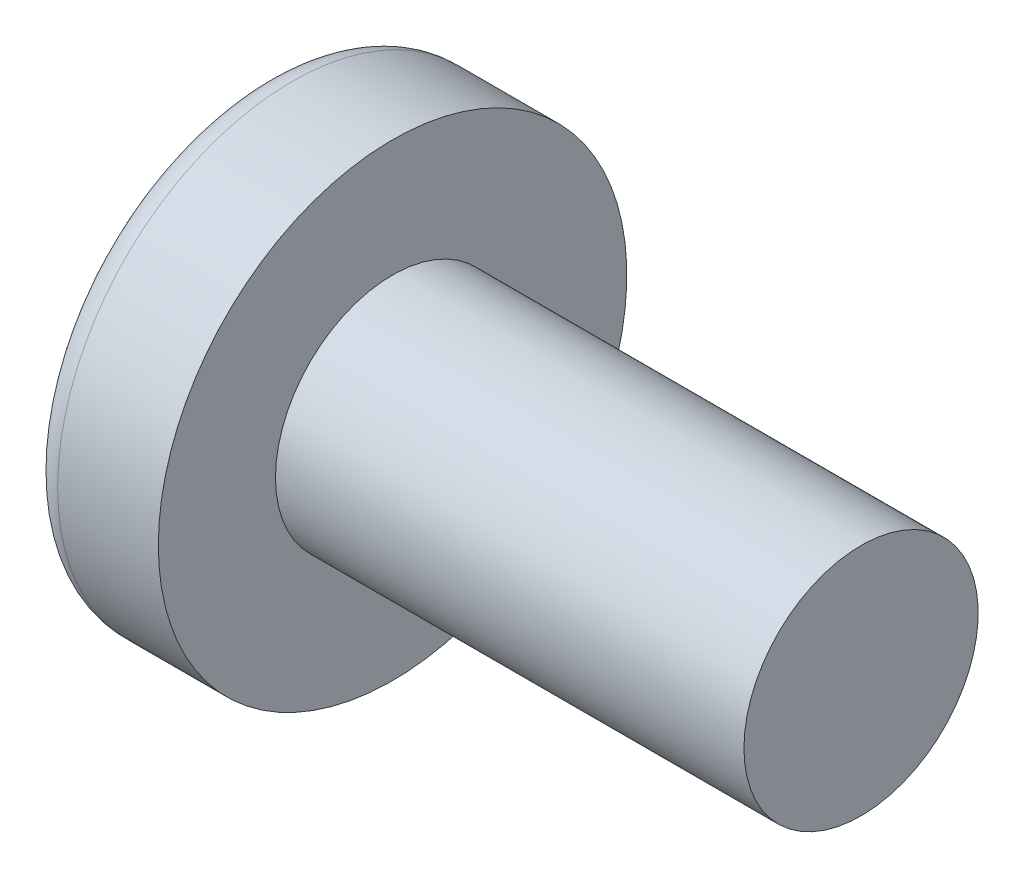
ISO-10303-21;
HEADER;
FILE_DESCRIPTION(('STEP AP214'),'2;1');
FILE_NAME('part.step','',(''),(''),'','','');
FILE_SCHEMA(('AUTOMOTIVE_DESIGN { 1 0 10303 214 1 1 1 1 }'));
ENDSEC;
DATA;
#1=APPLICATION_CONTEXT('core data for automotive mechanical design processes');
#2=APPLICATION_PROTOCOL_DEFINITION('international standard','automotive_design',2000,#1);
#3=PRODUCT_CONTEXT('',#1,'mechanical');
#4=PRODUCT('Part','Part','',(#3));
#5=PRODUCT_RELATED_PRODUCT_CATEGORY('part','',(#4));
#6=PRODUCT_DEFINITION_FORMATION('','',#4);
#7=PRODUCT_DEFINITION_CONTEXT('part definition',#1,'design');
#8=PRODUCT_DEFINITION('design','',#6,#7);
#9=PRODUCT_DEFINITION_SHAPE('','',#8);
#10=(LENGTH_UNIT() NAMED_UNIT(*) SI_UNIT(.MILLI.,.METRE.));
#11=(NAMED_UNIT(*) PLANE_ANGLE_UNIT() SI_UNIT($,.RADIAN.));
#12=(NAMED_UNIT(*) SI_UNIT($,.STERADIAN.) SOLID_ANGLE_UNIT());
#13=UNCERTAINTY_MEASURE_WITH_UNIT(LENGTH_MEASURE(1.E-05),#10,'distance_accuracy_value','');
#14=(GEOMETRIC_REPRESENTATION_CONTEXT(3) GLOBAL_UNCERTAINTY_ASSIGNED_CONTEXT((#13)) GLOBAL_UNIT_ASSIGNED_CONTEXT((#10,
#11,#12)) REPRESENTATION_CONTEXT('',''));
#15=CARTESIAN_POINT('',(0.,0.,0.));
#16=DIRECTION('',(0.,0.,1.));
#17=DIRECTION('',(1.,0.,0.));
#18=AXIS2_PLACEMENT_3D('',#15,#16,#17);
#19=CARTESIAN_POINT('',(1.53,0.175,-0.175));
#20=DIRECTION('',(-1.,0.,0.));
#21=DIRECTION('',(0.,0.,1.));
#22=AXIS2_PLACEMENT_3D('',#19,#20,#21);
#23=PLANE('',#22);
#24=DIRECTION('',(0.,1.,0.));
#25=VECTOR('',#24,1.);
#26=CARTESIAN_POINT('',(1.53,-0.175,0.175));
#27=LINE('',#26,#25);
#28=CARTESIAN_POINT('',(1.53000000000001,-0.175000000000024,0.17500000000007));
#29=VERTEX_POINT('',#28);
#30=CARTESIAN_POINT('',(1.53000000000001,0.175000000000047,0.175000000000024));
#31=VERTEX_POINT('',#30);
#32=EDGE_CURVE('E96',#29,#31,#27,.T.);
#33=ORIENTED_EDGE('',*,*,#32,.T.);
#34=DIRECTION('',(0.,0.,1.));
#35=VECTOR('',#34,1.);
#36=CARTESIAN_POINT('',(1.53,0.175,0.175));
#37=LINE('',#36,#35);
#38=CARTESIAN_POINT('',(1.53000000000001,0.175000000000023,-0.175000000000047));
#39=VERTEX_POINT('',#38);
#40=EDGE_CURVE('E179',#31,#39,#37,.F.);
#41=ORIENTED_EDGE('',*,*,#40,.T.);
#42=DIRECTION('',(0.,1.,0.));
#43=VECTOR('',#42,1.);
#44=CARTESIAN_POINT('',(1.53,0.175,-0.175));
#45=LINE('',#44,#43);
#46=CARTESIAN_POINT('',(1.53000000000001,-0.175000000000047,-0.175000000000024));
#47=VERTEX_POINT('',#46);
#48=EDGE_CURVE('E99',#39,#47,#45,.F.);
#49=ORIENTED_EDGE('',*,*,#48,.T.);
#50=DIRECTION('',(0.,0.,1.));
#51=VECTOR('',#50,1.);
#52=CARTESIAN_POINT('',(1.53,-0.175,-0.175));
#53=LINE('',#52,#51);
#54=EDGE_CURVE('E94',#47,#29,#53,.T.);
#55=ORIENTED_EDGE('',*,*,#54,.T.);
#56=EDGE_LOOP('',(#33,#41,#49,#55));
#57=FACE_BOUND('',#56,.T.);
#58=ADVANCED_FACE('F17',(#57),#23,.T.);
#59=CARTESIAN_POINT('',(1.53,0.175,-0.175));
#60=DIRECTION('',(0.605808178465619,0.,-0.795610740817499));
#61=DIRECTION('',(-0.795610740817499,0.,-0.605808178465619));
#62=AXIS2_PLACEMENT_3D('',#59,#60,#61);
#63=PLANE('',#62);
#64=ORIENTED_EDGE('',*,*,#48,.F.);
#65=DIRECTION('',(0.792336746135029,-0.0906267520091843,0.603315234802188));
#66=VECTOR('',#65,1.);
#67=CARTESIAN_POINT('',(0.195539940030044,0.327634320585383,-1.191108477036));
#68=LINE('',#67,#66);
#69=CARTESIAN_POINT('',(0.195539940029982,0.327634320585273,-1.19110847703603));
#70=VERTEX_POINT('',#69);
#71=EDGE_CURVE('E158',#70,#39,#68,.T.);
#72=ORIENTED_EDGE('',*,*,#71,.F.);
#73=CARTESIAN_POINT('',(0.19553994002992,-0.327634320585159,-1.19110847703605));
#74=CARTESIAN_POINT('',(0.18795976832639,-0.218422880390105,-1.19688030712404));
#75=CARTESIAN_POINT('',(0.184169682474625,-0.109211440195052,-1.19976622216803));
#76=CARTESIAN_POINT('',(0.184169682474625,0.109211440195056,-1.19976622216803));
#77=CARTESIAN_POINT('',(0.18795976832639,0.218422880390109,-1.19688030712404));
#78=CARTESIAN_POINT('',(0.195539940029921,0.327634320585163,-1.19110847703605));
#79=B_SPLINE_CURVE_WITH_KNOTS('',3,(#73,#74,#75,#76,#77,#78),.UNSPECIFIED.,.F.,.F.,(4,2,4),(0.,
0.327945860368665,0.65589172073733),.UNSPECIFIED.);
#80=CARTESIAN_POINT('',(0.195539940029981,-0.327634320585267,-1.19110847703603));
#81=VERTEX_POINT('',#80);
#82=EDGE_CURVE('E20',#81,#70,#79,.T.);
#83=ORIENTED_EDGE('',*,*,#82,.F.);
#84=DIRECTION('',(-0.79233674613503,-0.0906267520091801,-0.603315234802189));
#85=VECTOR('',#84,1.);
#86=CARTESIAN_POINT('',(1.53000000000001,-0.175000000000116,-0.175));
#87=LINE('',#86,#85);
#88=EDGE_CURVE('E163',#47,#81,#87,.T.);
#89=ORIENTED_EDGE('',*,*,#88,.F.);
#90=EDGE_LOOP('',(#64,#72,#83,#89));
#91=FACE_BOUND('',#90,.T.);
#92=ADVANCED_FACE('F301',(#91),#63,.F.);
#93=CARTESIAN_POINT('',(1.53,0.175,0.175));
#94=DIRECTION('',(0.605808178465619,0.795610740817499,0.));
#95=DIRECTION('',(-0.795610740817499,0.605808178465619,0.));
#96=AXIS2_PLACEMENT_3D('',#93,#94,#95);
#97=PLANE('',#96);
#98=ORIENTED_EDGE('',*,*,#40,.F.);
#99=DIRECTION('',(0.79233674613503,-0.603315234802189,-0.0906267520091823));
#100=VECTOR('',#99,1.);
#101=CARTESIAN_POINT('',(0.195539940030044,1.191108477036,0.327634320585379));
#102=LINE('',#101,#100);
#103=CARTESIAN_POINT('',(0.195539940029982,1.19110847703603,0.32763432058527));
#104=VERTEX_POINT('',#103);
#105=EDGE_CURVE('E143',#104,#31,#102,.T.);
#106=ORIENTED_EDGE('',*,*,#105,.F.);
#107=CARTESIAN_POINT('',(0.19553994002992,1.19110847703605,-0.327634320585162));
#108=CARTESIAN_POINT('',(0.187959768326372,1.19688030712378,-0.21842288039011));
#109=CARTESIAN_POINT('',(0.184169682474647,1.19976622216774,-0.109211440195056));
#110=CARTESIAN_POINT('',(0.184169682474842,1.19976622216812,0.109211440195063));
#111=CARTESIAN_POINT('',(0.187959768326763,1.19688030712455,0.218422880390129));
#112=CARTESIAN_POINT('',(0.195539940030506,1.1911084770372,0.327634320585196));
#113=B_SPLINE_CURVE_WITH_KNOTS('',3,(#107,#108,#109,#110,#111,#112),.UNSPECIFIED.,.F.,.F.,(4,2,
4),(0.,0.327945860368659,0.655891720737343),.UNSPECIFIED.);
#114=CARTESIAN_POINT('',(0.195539940029982,1.19110847703603,-0.32763432058527));
#115=VERTEX_POINT('',#114);
#116=EDGE_CURVE('E181',#115,#104,#113,.T.);
#117=ORIENTED_EDGE('',*,*,#116,.F.);
#118=DIRECTION('',(-0.79233674613503,0.603315234802189,-0.0906267520091823));
#119=VECTOR('',#118,1.);
#120=CARTESIAN_POINT('',(1.53000000000001,0.175,-0.175000000000117));
#121=LINE('',#120,#119);
#122=EDGE_CURVE('E148',#39,#115,#121,.T.);
#123=ORIENTED_EDGE('',*,*,#122,.F.);
#124=EDGE_LOOP('',(#98,#106,#117,#123));
#125=FACE_BOUND('',#124,.T.);
#126=ADVANCED_FACE('F298',(#125),#97,.F.);
#127=CARTESIAN_POINT('',(1.53,-0.175,0.175));
#128=DIRECTION('',(0.605808178465619,0.,0.795610740817499));
#129=DIRECTION('',(0.795610740817499,0.,-0.605808178465619));
#130=AXIS2_PLACEMENT_3D('',#127,#128,#129);
#131=PLANE('',#130);
#132=ORIENTED_EDGE('',*,*,#32,.F.);
#133=DIRECTION('',(0.792336746135029,0.0906267520091844,-0.603315234802188));
#134=VECTOR('',#133,1.);
#135=CARTESIAN_POINT('',(0.195539940030044,-0.327634320585383,1.191108477036));
#136=LINE('',#135,#134);
#137=CARTESIAN_POINT('',(0.195539940029982,-0.327634320585273,1.19110847703603));
#138=VERTEX_POINT('',#137);
#139=EDGE_CURVE('E107',#138,#29,#136,.T.);
#140=ORIENTED_EDGE('',*,*,#139,.F.);
#141=CARTESIAN_POINT('',(0.19553994002992,0.327634320585159,1.19110847703605));
#142=CARTESIAN_POINT('',(0.18795976832639,0.218422880390106,1.19688030712404));
#143=CARTESIAN_POINT('',(0.184169682474625,0.109211440195052,1.19976622216803));
#144=CARTESIAN_POINT('',(0.184169682474625,-0.109211440195055,1.19976622216803));
#145=CARTESIAN_POINT('',(0.18795976832639,-0.218422880390109,1.19688030712403));
#146=CARTESIAN_POINT('',(0.19553994002992,-0.327634320585162,1.19110847703605));
#147=B_SPLINE_CURVE_WITH_KNOTS('',3,(#141,#142,#143,#144,#145,#146),.UNSPECIFIED.,.F.,.F.,(4,2,
4),(0.,0.327945860368665,0.65589172073733),.UNSPECIFIED.);
#148=CARTESIAN_POINT('',(0.195539940029982,0.327634320585267,1.19110847703603));
#149=VERTEX_POINT('',#148);
#150=EDGE_CURVE('E112',#149,#138,#147,.T.);
#151=ORIENTED_EDGE('',*,*,#150,.F.);
#152=DIRECTION('',(-0.79233674613503,0.0906267520091802,0.603315234802189));
#153=VECTOR('',#152,1.);
#154=CARTESIAN_POINT('',(1.53000000000001,0.175000000000117,0.175));
#155=LINE('',#154,#153);
#156=EDGE_CURVE('E110',#31,#149,#155,.T.);
#157=ORIENTED_EDGE('',*,*,#156,.F.);
#158=EDGE_LOOP('',(#132,#140,#151,#157));
#159=FACE_BOUND('',#158,.T.);
#160=ADVANCED_FACE('F106',(#159),#131,.F.);
#161=CARTESIAN_POINT('',(1.53,-0.175,-0.175));
#162=DIRECTION('',(0.605808178465619,-0.795610740817499,0.));
#163=DIRECTION('',(0.795610740817499,0.605808178465619,0.));
#164=AXIS2_PLACEMENT_3D('',#161,#162,#163);
#165=PLANE('',#164);
#166=ORIENTED_EDGE('',*,*,#54,.F.);
#167=DIRECTION('',(0.79233674613503,0.603315234802189,0.0906267520091823));
#168=VECTOR('',#167,1.);
#169=CARTESIAN_POINT('',(0.195539940030044,-1.191108477036,-0.327634320585378));
#170=LINE('',#169,#168);
#171=CARTESIAN_POINT('',(0.195539940029982,-1.19110847703603,-0.32763432058527));
#172=VERTEX_POINT('',#171);
#173=EDGE_CURVE('E100',#172,#47,#170,.T.);
#174=ORIENTED_EDGE('',*,*,#173,.F.);
#175=CARTESIAN_POINT('',(0.19553994002992,-1.19110847703605,0.327634320585161));
#176=CARTESIAN_POINT('',(0.187959768326372,-1.19688030712378,0.218422880390109));
#177=CARTESIAN_POINT('',(0.184169682474647,-1.19976622216774,0.109211440195055));
#178=CARTESIAN_POINT('',(0.184169682474842,-1.19976622216812,-0.109211440195064));
#179=CARTESIAN_POINT('',(0.187959768326763,-1.19688030712455,-0.21842288039013));
#180=CARTESIAN_POINT('',(0.195539940030506,-1.1911084770372,-0.327634320585197));
#181=B_SPLINE_CURVE_WITH_KNOTS('',3,(#175,#176,#177,#178,#179,#180),.UNSPECIFIED.,.F.,.F.,(4,2,
4),(0.,0.327945860368659,0.655891720737343),.UNSPECIFIED.);
#182=CARTESIAN_POINT('',(0.195539940029982,-1.19110847703603,0.327634320585269));
#183=VERTEX_POINT('',#182);
#184=EDGE_CURVE('E40',#183,#172,#181,.T.);
#185=ORIENTED_EDGE('',*,*,#184,.F.);
#186=DIRECTION('',(-0.79233674613503,-0.603315234802189,0.0906267520091822));
#187=VECTOR('',#186,1.);
#188=CARTESIAN_POINT('',(1.53000000000001,-0.175,0.175000000000117));
#189=LINE('',#188,#187);
#190=EDGE_CURVE('E122',#29,#183,#189,.T.);
#191=ORIENTED_EDGE('',*,*,#190,.F.);
#192=EDGE_LOOP('',(#166,#174,#185,#191));
#193=FACE_BOUND('',#192,.T.);
#194=ADVANCED_FACE('F123',(#193),#165,.F.);
#195=CARTESIAN_POINT('',(1.75982832618,0.,-0.148712446352));
#196=DIRECTION('',(-0.113638160509999,0.,0.993522203312993));
#197=DIRECTION('',(0.993522203312993,0.,0.113638160509999));
#198=AXIS2_PLACEMENT_3D('',#195,#196,#197);
#199=PLANE('',#198);
#200=DIRECTION('',(0.987168682960103,0.112911450665712,0.112911450665468));
#201=VECTOR('',#200,1.);
#202=CARTESIAN_POINT('',(0.0301382525496957,-0.346552814251487,-0.346552814251));
#203=LINE('',#202,#201);
#204=CARTESIAN_POINT('',(0.0301382525497051,-0.346552814251486,-0.346552814251049));
#205=VERTEX_POINT('',#204);
#206=EDGE_CURVE('E74',#205,#47,#203,.T.);
#207=ORIENTED_EDGE('',*,*,#206,.F.);
#208=CARTESIAN_POINT('',(0.195539940029933,-1.19110847703603,-0.327634320585392));
#209=CARTESIAN_POINT('',(0.152876044928763,-1.0533445365469,-0.332514177868217));
#210=CARTESIAN_POINT('',(0.117760623421494,-0.914082927736931,-0.336530647648472));
#211=CARTESIAN_POINT('',(0.0626267275947612,-0.632564373475339,-0.342836812203841));
#212=CARTESIAN_POINT('',(0.0426082532752965,-0.490307428023714,-0.345126506978955));
#213=CARTESIAN_POINT('',(0.0301382525497336,-0.34655281425126,-0.346552814251499));
#214=B_SPLINE_CURVE_WITH_KNOTS('',3,(#208,#209,#210,#211,#212,#213),.UNSPECIFIED.,.F.,.F.,(4,2,
4),(0.,0.431030375854441,0.862060751708881),.UNSPECIFIED.);
#215=EDGE_CURVE('E126',#172,#205,#214,.T.);
#216=ORIENTED_EDGE('',*,*,#215,.F.);
#217=ORIENTED_EDGE('',*,*,#173,.T.);
#218=EDGE_LOOP('',(#207,#216,#217));
#219=FACE_BOUND('',#218,.T.);
#220=ADVANCED_FACE('F266',(#219),#199,.T.);
#221=CARTESIAN_POINT('',(1.75982832618,-0.148712446352,0.));
#222=DIRECTION('',(-0.113638160509999,0.993522203312993,0.));
#223=DIRECTION('',(-0.993522203312993,-0.113638160509999,0.));
#224=AXIS2_PLACEMENT_3D('',#221,#222,#223);
#225=PLANE('',#224);
#226=ORIENTED_EDGE('',*,*,#206,.T.);
#227=ORIENTED_EDGE('',*,*,#88,.T.);
#228=CARTESIAN_POINT('',(0.0301382525497145,-0.346552814251485,-0.346552814251098));
#229=CARTESIAN_POINT('',(0.0426082532752755,-0.345126506978949,-0.49030742802358));
#230=CARTESIAN_POINT('',(0.0626267275947409,-0.342836812203839,-0.632564373475233));
#231=CARTESIAN_POINT('',(0.11776062342148,-0.336530647648473,-0.914082927736879));
#232=CARTESIAN_POINT('',(0.152876044928754,-0.332514177868217,-1.05334453654687));
#233=CARTESIAN_POINT('',(0.195539940029933,-0.327634320585387,-1.19110847703603));
#234=B_SPLINE_CURVE_WITH_KNOTS('',3,(#228,#229,#230,#231,#232,#233),.UNSPECIFIED.,.F.,.F.,(4,2,
4),(0.,0.431030375854523,0.862060751709045),.UNSPECIFIED.);
#235=EDGE_CURVE('E270',#205,#81,#234,.T.);
#236=ORIENTED_EDGE('',*,*,#235,.F.);
#237=EDGE_LOOP('',(#226,#227,#236));
#238=FACE_BOUND('',#237,.T.);
#239=ADVANCED_FACE('F261',(#238),#225,.T.);
#240=CARTESIAN_POINT('',(1.75982832618,0.148712446352,0.));
#241=DIRECTION('',(-0.113638160509999,-0.993522203312993,0.));
#242=DIRECTION('',(0.993522203312993,-0.113638160509999,0.));
#243=AXIS2_PLACEMENT_3D('',#240,#241,#242);
#244=PLANE('',#243);
#245=ORIENTED_EDGE('',*,*,#71,.T.);
#246=DIRECTION('',(0.987168682960103,-0.112911450665468,0.112911450665712));
#247=VECTOR('',#246,1.);
#248=CARTESIAN_POINT('',(0.0301382525496959,0.346552814251,-0.346552814251488));
#249=LINE('',#248,#247);
#250=CARTESIAN_POINT('',(0.0301382525497061,0.346552814251049,-0.346552814251488));
#251=VERTEX_POINT('',#250);
#252=EDGE_CURVE('E153',#251,#39,#249,.T.);
#253=ORIENTED_EDGE('',*,*,#252,.F.);
#254=CARTESIAN_POINT('',(0.195539940029933,0.327634320585395,-1.19110847703603));
#255=CARTESIAN_POINT('',(0.15287604492876,0.332514177868223,-1.05334453654689));
#256=CARTESIAN_POINT('',(0.117760623421489,0.336530647648478,-0.91408292773691));
#257=CARTESIAN_POINT('',(0.0626267275947526,0.342836812203842,-0.632564373475297));
#258=CARTESIAN_POINT('',(0.0426082532752867,0.345126506978951,-0.490307428023661));
#259=CARTESIAN_POINT('',(0.0301382525497232,0.346552814251487,-0.346552814251195));
#260=B_SPLINE_CURVE_WITH_KNOTS('',3,(#254,#255,#256,#257,#258,#259),.UNSPECIFIED.,.F.,.F.,(4,2,
4),(0.,0.431030375854474,0.862060751708948),.UNSPECIFIED.);
#261=EDGE_CURVE('E246',#70,#251,#260,.T.);
#262=ORIENTED_EDGE('',*,*,#261,.F.);
#263=EDGE_LOOP('',(#245,#253,#262));
#264=FACE_BOUND('',#263,.T.);
#265=ADVANCED_FACE('F256',(#264),#244,.T.);
#266=CARTESIAN_POINT('',(1.75982832618,0.,-0.148712446352));
#267=DIRECTION('',(-0.113638160509999,0.,0.993522203312993));
#268=DIRECTION('',(0.993522203312993,0.,0.113638160509999));
#269=AXIS2_PLACEMENT_3D('',#266,#267,#268);
#270=PLANE('',#269);
#271=ORIENTED_EDGE('',*,*,#252,.T.);
#272=ORIENTED_EDGE('',*,*,#122,.T.);
#273=CARTESIAN_POINT('',(0.0301382525497163,0.346552814251097,-0.346552814251487));
#274=CARTESIAN_POINT('',(0.0426082532752764,0.49030742802358,-0.345126506978951));
#275=CARTESIAN_POINT('',(0.0626267275947411,0.632564373475233,-0.342836812203842));
#276=CARTESIAN_POINT('',(0.11776062342148,0.914082927736878,-0.336530647648476));
#277=CARTESIAN_POINT('',(0.152876044928754,1.05334453654687,-0.33251417786822));
#278=CARTESIAN_POINT('',(0.195539940029933,1.19110847703603,-0.32763432058539));
#279=B_SPLINE_CURVE_WITH_KNOTS('',3,(#273,#274,#275,#276,#277,#278),.UNSPECIFIED.,.F.,.F.,(4,2,
4),(0.,0.431030375854522,0.862060751709044),.UNSPECIFIED.);
#280=EDGE_CURVE('E239',#251,#115,#279,.T.);
#281=ORIENTED_EDGE('',*,*,#280,.F.);
#282=EDGE_LOOP('',(#271,#272,#281));
#283=FACE_BOUND('',#282,.T.);
#284=ADVANCED_FACE('F253',(#283),#270,.T.);
#285=CARTESIAN_POINT('',(1.75982832618,0.,0.148712446352));
#286=DIRECTION('',(-0.113638160509999,0.,-0.993522203312993));
#287=DIRECTION('',(-0.993522203312993,0.,0.113638160509999));
#288=AXIS2_PLACEMENT_3D('',#285,#286,#287);
#289=PLANE('',#288);
#290=DIRECTION('',(0.987168682960103,-0.112911450665712,-0.112911450665468));
#291=VECTOR('',#290,1.);
#292=CARTESIAN_POINT('',(0.0301382525496957,0.346552814251487,0.346552814251));
#293=LINE('',#292,#291);
#294=CARTESIAN_POINT('',(0.0301382525497051,0.346552814251486,0.346552814251048));
#295=VERTEX_POINT('',#294);
#296=EDGE_CURVE('E139',#295,#31,#293,.T.);
#297=ORIENTED_EDGE('',*,*,#296,.F.);
#298=CARTESIAN_POINT('',(0.195539940029933,1.19110847703603,0.327634320585391));
#299=CARTESIAN_POINT('',(0.152876044928762,1.0533445365469,0.332514177868217));
#300=CARTESIAN_POINT('',(0.117760623421493,0.914082927736931,0.336530647648472));
#301=CARTESIAN_POINT('',(0.0626267275947594,0.632564373475339,0.342836812203842));
#302=CARTESIAN_POINT('',(0.0426082532752946,0.490307428023714,0.345126506978956));
#303=CARTESIAN_POINT('',(0.0301382525497319,0.346552814251259,0.3465528142515));
#304=B_SPLINE_CURVE_WITH_KNOTS('',3,(#298,#299,#300,#301,#302,#303),.UNSPECIFIED.,.F.,.F.,(4,2,
4),(0.,0.431030375854441,0.862060751708882),.UNSPECIFIED.);
#305=EDGE_CURVE('E232',#104,#295,#304,.T.);
#306=ORIENTED_EDGE('',*,*,#305,.F.);
#307=ORIENTED_EDGE('',*,*,#105,.T.);
#308=EDGE_LOOP('',(#297,#306,#307));
#309=FACE_BOUND('',#308,.T.);
#310=ADVANCED_FACE('F221',(#309),#289,.T.);
#311=CARTESIAN_POINT('',(1.75982832618,0.148712446352,0.));
#312=DIRECTION('',(-0.113638160509999,-0.993522203312993,0.));
#313=DIRECTION('',(0.993522203312993,-0.113638160509999,0.));
#314=AXIS2_PLACEMENT_3D('',#311,#312,#313);
#315=PLANE('',#314);
#316=ORIENTED_EDGE('',*,*,#296,.T.);
#317=ORIENTED_EDGE('',*,*,#156,.T.);
#318=CARTESIAN_POINT('',(0.0301382525497145,0.346552814251485,0.346552814251097));
#319=CARTESIAN_POINT('',(0.0426082532752754,0.345126506978949,0.490307428023579));
#320=CARTESIAN_POINT('',(0.0626267275947407,0.342836812203839,0.632564373475232));
#321=CARTESIAN_POINT('',(0.11776062342148,0.336530647648473,0.914082927736878));
#322=CARTESIAN_POINT('',(0.152876044928754,0.332514177868217,1.05334453654687));
#323=CARTESIAN_POINT('',(0.195539940029933,0.327634320585387,1.19110847703603));
#324=B_SPLINE_CURVE_WITH_KNOTS('',3,(#318,#319,#320,#321,#322,#323),.UNSPECIFIED.,.F.,.F.,(4,2,
4),(0.,0.431030375854522,0.862060751709045),.UNSPECIFIED.);
#325=EDGE_CURVE('E225',#295,#149,#324,.T.);
#326=ORIENTED_EDGE('',*,*,#325,.F.);
#327=EDGE_LOOP('',(#316,#317,#326));
#328=FACE_BOUND('',#327,.T.);
#329=ADVANCED_FACE('F217',(#328),#315,.T.);
#330=CARTESIAN_POINT('',(1.75982832618,-0.148712446352,0.));
#331=DIRECTION('',(-0.113638160509999,0.993522203312993,0.));
#332=DIRECTION('',(-0.993522203312993,-0.113638160509999,0.));
#333=AXIS2_PLACEMENT_3D('',#330,#331,#332);
#334=PLANE('',#333);
#335=ORIENTED_EDGE('',*,*,#139,.T.);
#336=DIRECTION('',(0.987168682960103,0.112911450665468,-0.112911450665712));
#337=VECTOR('',#336,1.);
#338=CARTESIAN_POINT('',(0.0301382525496959,-0.346552814251,0.346552814251488));
#339=LINE('',#338,#337);
#340=CARTESIAN_POINT('',(0.030138252549706,-0.346552814251049,0.346552814251487));
#341=VERTEX_POINT('',#340);
#342=EDGE_CURVE('E117',#341,#29,#339,.T.);
#343=ORIENTED_EDGE('',*,*,#342,.F.);
#344=CARTESIAN_POINT('',(0.195539940029933,-0.327634320585395,1.19110847703603));
#345=CARTESIAN_POINT('',(0.152876044928759,-0.332514177868224,1.05334453654689));
#346=CARTESIAN_POINT('',(0.117760623421488,-0.336530647648479,0.914082927736909));
#347=CARTESIAN_POINT('',(0.0626267275947518,-0.342836812203842,0.632564373475296));
#348=CARTESIAN_POINT('',(0.0426082532752862,-0.345126506978951,0.49030742802366));
#349=CARTESIAN_POINT('',(0.0301382525497232,-0.346552814251486,0.346552814251194));
#350=B_SPLINE_CURVE_WITH_KNOTS('',3,(#344,#345,#346,#347,#348,#349),.UNSPECIFIED.,.F.,.F.,(4,2,
4),(0.,0.431030375854474,0.862060751708948),.UNSPECIFIED.);
#351=EDGE_CURVE('E120',#138,#341,#350,.T.);
#352=ORIENTED_EDGE('',*,*,#351,.F.);
#353=EDGE_LOOP('',(#335,#343,#352));
#354=FACE_BOUND('',#353,.T.);
#355=ADVANCED_FACE('F115',(#354),#334,.T.);
#356=CARTESIAN_POINT('',(1.75982832618,0.,0.148712446352));
#357=DIRECTION('',(-0.113638160509999,0.,-0.993522203312993));
#358=DIRECTION('',(-0.993522203312993,0.,0.113638160509999));
#359=AXIS2_PLACEMENT_3D('',#356,#357,#358);
#360=PLANE('',#359);
#361=ORIENTED_EDGE('',*,*,#342,.T.);
#362=ORIENTED_EDGE('',*,*,#190,.T.);
#363=CARTESIAN_POINT('',(0.0301382525497162,-0.346552814251097,0.346552814251485));
#364=CARTESIAN_POINT('',(0.0426082532752764,-0.49030742802358,0.34512650697895));
#365=CARTESIAN_POINT('',(0.0626267275947412,-0.632564373475232,0.342836812203841));
#366=CARTESIAN_POINT('',(0.11776062342148,-0.914082927736878,0.336530647648476));
#367=CARTESIAN_POINT('',(0.152876044928754,-1.05334453654687,0.33251417786822));
#368=CARTESIAN_POINT('',(0.195539940029933,-1.19110847703603,0.327634320585391));
#369=B_SPLINE_CURVE_WITH_KNOTS('',3,(#363,#364,#365,#366,#367,#368),.UNSPECIFIED.,.F.,.F.,(4,2,
4),(0.,0.431030375854522,0.862060751709045),.UNSPECIFIED.);
#370=EDGE_CURVE('E129',#341,#183,#369,.T.);
#371=ORIENTED_EDGE('',*,*,#370,.F.);
#372=EDGE_LOOP('',(#361,#362,#371));
#373=FACE_BOUND('',#372,.T.);
#374=ADVANCED_FACE('F128',(#373),#360,.T.);
#375=CARTESIAN_POINT('',(4.,0.,0.));
#376=DIRECTION('',(0.,1.,0.));
#377=DIRECTION('',(1.,0.,0.));
#378=AXIS2_PLACEMENT_3D('',#375,#376,#377);
#379=SPHERICAL_SURFACE('',#378,4.);
#380=CARTESIAN_POINT('',(0.78389734472545,0.,0.));
#381=DIRECTION('',(-1.,0.,0.));
#382=DIRECTION('',(0.,0.,1.));
#383=AXIS2_PLACEMENT_3D('',#380,#381,#382);
#384=CIRCLE('',#383,2.37837837837841);
#385=CARTESIAN_POINT('',(0.78389734472545,0.,2.37837837837841));
#386=VERTEX_POINT('',#385);
#387=EDGE_CURVE('E193',#386,#386,#384,.F.);
#388=ORIENTED_EDGE('',*,*,#387,.F.);
#389=EDGE_LOOP('',(#388));
#390=FACE_BOUND('',#389,.T.);
#391=ORIENTED_EDGE('',*,*,#370,.T.);
#392=ORIENTED_EDGE('',*,*,#184,.T.);
#393=ORIENTED_EDGE('',*,*,#215,.T.);
#394=ORIENTED_EDGE('',*,*,#235,.T.);
#395=ORIENTED_EDGE('',*,*,#82,.T.);
#396=ORIENTED_EDGE('',*,*,#261,.T.);
#397=ORIENTED_EDGE('',*,*,#280,.T.);
#398=ORIENTED_EDGE('',*,*,#116,.T.);
#399=ORIENTED_EDGE('',*,*,#305,.T.);
#400=ORIENTED_EDGE('',*,*,#325,.T.);
#401=ORIENTED_EDGE('',*,*,#150,.T.);
#402=ORIENTED_EDGE('',*,*,#351,.T.);
#403=EDGE_LOOP('',(#391,#392,#393,#394,#395,#396,#397,#398,#399,#400,#401,#402));
#404=FACE_BOUND('',#403,.T.);
#405=ADVANCED_FACE('F208',(#390,#404),#379,.T.);
#406=CARTESIAN_POINT('',(1.025105043871,0.,0.));
#407=DIRECTION('',(-1.,0.,0.));
#408=DIRECTION('',(0.,0.,1.));
#409=AXIS2_PLACEMENT_3D('',#406,#407,#408);
#410=TOROIDAL_SURFACE('',#409,2.2,0.3);
#411=ORIENTED_EDGE('',*,*,#387,.T.);
#412=EDGE_LOOP('',(#411));
#413=FACE_BOUND('',#412,.T.);
#414=CARTESIAN_POINT('',(1.025105043871,0.,0.));
#415=DIRECTION('',(-1.,0.,0.));
#416=DIRECTION('',(0.,0.,1.));
#417=AXIS2_PLACEMENT_3D('',#414,#415,#416);
#418=CIRCLE('',#417,2.5);
#419=CARTESIAN_POINT('',(1.025105043871,0.,2.5));
#420=VERTEX_POINT('',#419);
#421=EDGE_CURVE('E192',#420,#420,#418,.F.);
#422=ORIENTED_EDGE('',*,*,#421,.F.);
#423=EDGE_LOOP('',(#422));
#424=FACE_BOUND('',#423,.T.);
#425=ADVANCED_FACE('F338',(#413,#424),#410,.T.);
#426=CARTESIAN_POINT('',(-25.4,0.,0.));
#427=DIRECTION('',(-1.,0.,0.));
#428=DIRECTION('',(0.,0.,1.));
#429=AXIS2_PLACEMENT_3D('',#426,#427,#428);
#430=CYLINDRICAL_SURFACE('',#429,2.5);
#431=ORIENTED_EDGE('',*,*,#421,.T.);
#432=EDGE_LOOP('',(#431));
#433=FACE_BOUND('',#432,.T.);
#434=CARTESIAN_POINT('',(2.1,0.,0.));
#435=DIRECTION('',(-1.,0.,0.));
#436=DIRECTION('',(0.,0.,1.));
#437=AXIS2_PLACEMENT_3D('',#434,#435,#436);
#438=CIRCLE('',#437,2.5);
#439=CARTESIAN_POINT('',(2.1,0.,2.5));
#440=VERTEX_POINT('',#439);
#441=EDGE_CURVE('E189',#440,#440,#438,.T.);
#442=ORIENTED_EDGE('',*,*,#441,.T.);
#443=EDGE_LOOP('',(#442));
#444=FACE_BOUND('',#443,.T.);
#445=ADVANCED_FACE('F335',(#433,#444),#430,.T.);
#446=CARTESIAN_POINT('',(7.1,1.25,0.));
#447=DIRECTION('',(1.,0.,0.));
#448=DIRECTION('',(0.,0.,-1.));
#449=AXIS2_PLACEMENT_3D('',#446,#447,#448);
#450=PLANE('',#449);
#451=CARTESIAN_POINT('',(7.1,0.,0.));
#452=DIRECTION('',(-1.,0.,0.));
#453=DIRECTION('',(0.,0.,1.));
#454=AXIS2_PLACEMENT_3D('',#451,#452,#453);
#455=CIRCLE('',#454,1.25);
#456=CARTESIAN_POINT('',(7.1,0.,1.25));
#457=VERTEX_POINT('',#456);
#458=EDGE_CURVE('E31',#457,#457,#455,.T.);
#459=ORIENTED_EDGE('',*,*,#458,.F.);
#460=EDGE_LOOP('',(#459));
#461=FACE_BOUND('',#460,.T.);
#462=ADVANCED_FACE('F328',(#461),#450,.T.);
#463=CARTESIAN_POINT('',(2.1,1.25,0.));
#464=DIRECTION('',(-1.,0.,0.));
#465=DIRECTION('',(0.,0.,1.));
#466=AXIS2_PLACEMENT_3D('',#463,#464,#465);
#467=PLANE('',#466);
#468=CARTESIAN_POINT('',(2.1,0.,0.));
#469=DIRECTION('',(-1.,0.,0.));
#470=DIRECTION('',(0.,0.,1.));
#471=AXIS2_PLACEMENT_3D('',#468,#469,#470);
#472=CIRCLE('',#471,1.25);
#473=CARTESIAN_POINT('',(2.1,0.,1.25));
#474=VERTEX_POINT('',#473);
#475=EDGE_CURVE('E11',#474,#474,#472,.F.);
#476=ORIENTED_EDGE('',*,*,#475,.F.);
#477=EDGE_LOOP('',(#476));
#478=FACE_BOUND('',#477,.T.);
#479=ORIENTED_EDGE('',*,*,#441,.F.);
#480=EDGE_LOOP('',(#479));
#481=FACE_BOUND('',#480,.T.);
#482=ADVANCED_FACE('F322',(#478,#481),#467,.F.);
#483=CARTESIAN_POINT('',(-25.4,0.,0.));
#484=DIRECTION('',(-1.,0.,0.));
#485=DIRECTION('',(0.,0.,1.));
#486=AXIS2_PLACEMENT_3D('',#483,#484,#485);
#487=CYLINDRICAL_SURFACE('',#486,1.25);
#488=ORIENTED_EDGE('',*,*,#475,.T.);
#489=EDGE_LOOP('',(#488));
#490=FACE_BOUND('',#489,.T.);
#491=ORIENTED_EDGE('',*,*,#458,.T.);
#492=EDGE_LOOP('',(#491));
#493=FACE_BOUND('',#492,.T.);
#494=ADVANCED_FACE('F320',(#490,#493),#487,.T.);
#495=CLOSED_SHELL('',(#58,#92,#126,#160,#194,#220,#239,#265,#284,#310,#329,#355,#374,#405,#425,
#445,#462,#482,#494));
#496=MANIFOLD_SOLID_BREP('B1',#495);
#497=ADVANCED_BREP_SHAPE_REPRESENTATION('',(#18,#496),#14);
#498=SHAPE_DEFINITION_REPRESENTATION(#9,#497);
ENDSEC;
END-ISO-10303-21;
